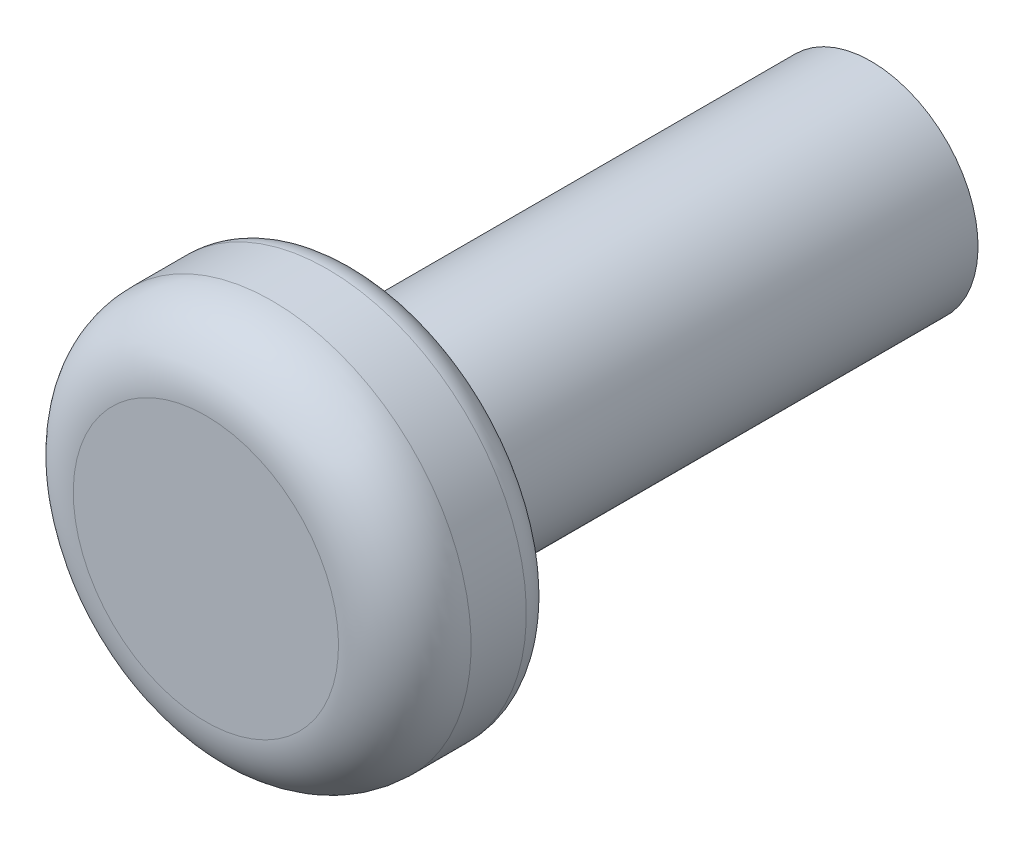
ISO-10303-21;
HEADER;
FILE_DESCRIPTION(('STEP AP214'),'2;1');
FILE_NAME('part.step','',(''),(''),'','','');
FILE_SCHEMA(('AUTOMOTIVE_DESIGN { 1 0 10303 214 1 1 1 1 }'));
ENDSEC;
DATA;
#1=APPLICATION_CONTEXT('core data for automotive mechanical design processes');
#2=APPLICATION_PROTOCOL_DEFINITION('international standard','automotive_design',2000,#1);
#3=PRODUCT_CONTEXT('',#1,'mechanical');
#4=PRODUCT('Part','Part','',(#3));
#5=PRODUCT_RELATED_PRODUCT_CATEGORY('part','',(#4));
#6=PRODUCT_DEFINITION_FORMATION('','',#4);
#7=PRODUCT_DEFINITION_CONTEXT('part definition',#1,'design');
#8=PRODUCT_DEFINITION('design','',#6,#7);
#9=PRODUCT_DEFINITION_SHAPE('','',#8);
#10=(LENGTH_UNIT() NAMED_UNIT(*) SI_UNIT(.MILLI.,.METRE.));
#11=(NAMED_UNIT(*) PLANE_ANGLE_UNIT() SI_UNIT($,.RADIAN.));
#12=(NAMED_UNIT(*) SI_UNIT($,.STERADIAN.) SOLID_ANGLE_UNIT());
#13=UNCERTAINTY_MEASURE_WITH_UNIT(LENGTH_MEASURE(1.E-05),#10,'distance_accuracy_value','');
#14=(GEOMETRIC_REPRESENTATION_CONTEXT(3) GLOBAL_UNCERTAINTY_ASSIGNED_CONTEXT((#13)) GLOBAL_UNIT_ASSIGNED_CONTEXT((#10,
#11,#12)) REPRESENTATION_CONTEXT('',''));
#15=CARTESIAN_POINT('',(0.,0.,0.));
#16=DIRECTION('',(0.,0.,1.));
#17=DIRECTION('',(1.,0.,0.));
#18=AXIS2_PLACEMENT_3D('',#15,#16,#17);
#19=CARTESIAN_POINT('',(0.,0.,0.));
#20=DIRECTION('',(0.,0.,1.));
#21=DIRECTION('',(0.,-1.,0.));
#22=AXIS2_PLACEMENT_3D('',#19,#20,#21);
#23=PLANE('',#22);
#24=CARTESIAN_POINT('',(0.,0.,0.));
#25=DIRECTION('',(0.,0.,-1.));
#26=DIRECTION('',(0.,1.,0.));
#27=AXIS2_PLACEMENT_3D('',#24,#25,#26);
#28=CIRCLE('',#27,2.5);
#29=CARTESIAN_POINT('',(0.,2.5,0.));
#30=VERTEX_POINT('',#29);
#31=EDGE_CURVE('E11',#30,#30,#28,.T.);
#32=ORIENTED_EDGE('',*,*,#31,.F.);
#33=EDGE_LOOP('',(#32));
#34=FACE_BOUND('',#33,.T.);
#35=ADVANCED_FACE('F43',(#34),#23,.T.);
#36=CARTESIAN_POINT('',(0.,0.,0.));
#37=DIRECTION('',(0.,0.,-1.));
#38=DIRECTION('',(0.,1.,0.));
#39=AXIS2_PLACEMENT_3D('',#36,#37,#38);
#40=CYLINDRICAL_SURFACE('',#39,2.5);
#41=ORIENTED_EDGE('',*,*,#31,.T.);
#42=EDGE_LOOP('',(#41));
#43=FACE_BOUND('',#42,.T.);
#44=CARTESIAN_POINT('',(0.,0.,-12.));
#45=DIRECTION('',(0.,0.,-1.));
#46=DIRECTION('',(0.,1.,0.));
#47=AXIS2_PLACEMENT_3D('',#44,#45,#46);
#48=CIRCLE('',#47,2.5);
#49=CARTESIAN_POINT('',(0.,2.5,-12.));
#50=VERTEX_POINT('',#49);
#51=EDGE_CURVE('E49',#50,#50,#48,.T.);
#52=ORIENTED_EDGE('',*,*,#51,.F.);
#53=EDGE_LOOP('',(#52));
#54=FACE_BOUND('',#53,.T.);
#55=ADVANCED_FACE('F57',(#43,#54),#40,.T.);
#56=CARTESIAN_POINT('',(0.,0.,-12.));
#57=DIRECTION('',(0.,0.,-1.));
#58=DIRECTION('',(0.,1.,0.));
#59=AXIS2_PLACEMENT_3D('',#56,#57,#58);
#60=PLANE('',#59);
#61=ORIENTED_EDGE('',*,*,#51,.T.);
#62=EDGE_LOOP('',(#61));
#63=FACE_BOUND('',#62,.T.);
#64=ADVANCED_FACE('F55',(#63),#60,.T.);
#65=CLOSED_SHELL('',(#35,#55,#64));
#66=MANIFOLD_SOLID_BREP('B2',#65);
#67=CARTESIAN_POINT('',(0.,0.,0.));
#68=DIRECTION('',(0.,0.,1.));
#69=DIRECTION('',(1.,0.,0.));
#70=AXIS2_PLACEMENT_3D('',#67,#68,#69);
#71=PLANE('',#70);
#72=CARTESIAN_POINT('',(0.,0.,0.));
#73=DIRECTION('',(0.,0.,-1.));
#74=DIRECTION('',(0.,1.,0.));
#75=AXIS2_PLACEMENT_3D('',#72,#73,#74);
#76=CIRCLE('',#75,3.94);
#77=CARTESIAN_POINT('',(0.,3.94,0.));
#78=VERTEX_POINT('',#77);
#79=EDGE_CURVE('E91',#78,#78,#76,.T.);
#80=ORIENTED_EDGE('',*,*,#79,.T.);
#81=EDGE_LOOP('',(#80));
#82=FACE_BOUND('',#81,.T.);
#83=ADVANCED_FACE('F84',(#82),#71,.F.);
#84=CARTESIAN_POINT('',(0.,0.,0.709999999999999));
#85=DIRECTION('',(0.,0.,-1.));
#86=DIRECTION('',(0.,1.,0.));
#87=AXIS2_PLACEMENT_3D('',#84,#85,#86);
#88=TOROIDAL_SURFACE('',#87,3.94,0.71);
#89=ORIENTED_EDGE('',*,*,#79,.F.);
#90=EDGE_LOOP('',(#89));
#91=FACE_BOUND('',#90,.T.);
#92=CARTESIAN_POINT('',(0.,0.,0.709999999999999));
#93=DIRECTION('',(0.,0.,-1.));
#94=DIRECTION('',(0.,1.,0.));
#95=AXIS2_PLACEMENT_3D('',#92,#93,#94);
#96=CIRCLE('',#95,4.65);
#97=CARTESIAN_POINT('',(0.,4.65,0.71));
#98=VERTEX_POINT('',#97);
#99=EDGE_CURVE('E95',#98,#98,#96,.T.);
#100=ORIENTED_EDGE('',*,*,#99,.T.);
#101=EDGE_LOOP('',(#100));
#102=FACE_BOUND('',#101,.T.);
#103=ADVANCED_FACE('F117',(#91,#102),#88,.T.);
#104=CARTESIAN_POINT('',(0.,0.,3.55));
#105=DIRECTION('',(0.,0.,-1.));
#106=DIRECTION('',(-1.,0.,0.));
#107=AXIS2_PLACEMENT_3D('',#104,#105,#106);
#108=CYLINDRICAL_SURFACE('',#107,4.65);
#109=CARTESIAN_POINT('',(0.,0.,2.));
#110=DIRECTION('',(0.,0.,-1.));
#111=DIRECTION('',(0.,1.,0.));
#112=AXIS2_PLACEMENT_3D('',#109,#110,#111);
#113=CIRCLE('',#112,4.65);
#114=CARTESIAN_POINT('',(0.,4.65,2.));
#115=VERTEX_POINT('',#114);
#116=EDGE_CURVE('E99',#115,#115,#113,.T.);
#117=ORIENTED_EDGE('',*,*,#116,.T.);
#118=EDGE_LOOP('',(#117));
#119=FACE_BOUND('',#118,.T.);
#120=ORIENTED_EDGE('',*,*,#99,.F.);
#121=EDGE_LOOP('',(#120));
#122=FACE_BOUND('',#121,.T.);
#123=ADVANCED_FACE('F86',(#119,#122),#108,.T.);
#124=CARTESIAN_POINT('',(0.,0.,2.));
#125=DIRECTION('',(0.,0.,-1.));
#126=DIRECTION('',(0.,1.,0.));
#127=AXIS2_PLACEMENT_3D('',#124,#125,#126);
#128=TOROIDAL_SURFACE('',#127,3.1,1.55);
#129=ORIENTED_EDGE('',*,*,#116,.F.);
#130=EDGE_LOOP('',(#129));
#131=FACE_BOUND('',#130,.T.);
#132=CARTESIAN_POINT('',(0.,0.,3.55));
#133=DIRECTION('',(0.,0.,-1.));
#134=DIRECTION('',(0.,1.,0.));
#135=AXIS2_PLACEMENT_3D('',#132,#133,#134);
#136=CIRCLE('',#135,3.1);
#137=CARTESIAN_POINT('',(0.,3.1,3.55));
#138=VERTEX_POINT('',#137);
#139=EDGE_CURVE('E42',#138,#138,#136,.T.);
#140=ORIENTED_EDGE('',*,*,#139,.T.);
#141=EDGE_LOOP('',(#140));
#142=FACE_BOUND('',#141,.T.);
#143=ADVANCED_FACE('F107',(#131,#142),#128,.T.);
#144=CARTESIAN_POINT('',(0.,0.,3.55));
#145=DIRECTION('',(0.,0.,1.));
#146=DIRECTION('',(1.,0.,0.));
#147=AXIS2_PLACEMENT_3D('',#144,#145,#146);
#148=PLANE('',#147);
#149=ORIENTED_EDGE('',*,*,#139,.F.);
#150=EDGE_LOOP('',(#149));
#151=FACE_BOUND('',#150,.T.);
#152=ADVANCED_FACE('F109',(#151),#148,.T.);
#153=CLOSED_SHELL('',(#83,#103,#123,#143,#152));
#154=MANIFOLD_SOLID_BREP('B6',#153);
#155=ADVANCED_BREP_SHAPE_REPRESENTATION('',(#18,#66,#154),#14);
#156=SHAPE_DEFINITION_REPRESENTATION(#9,#155);
ENDSEC;
END-ISO-10303-21;
